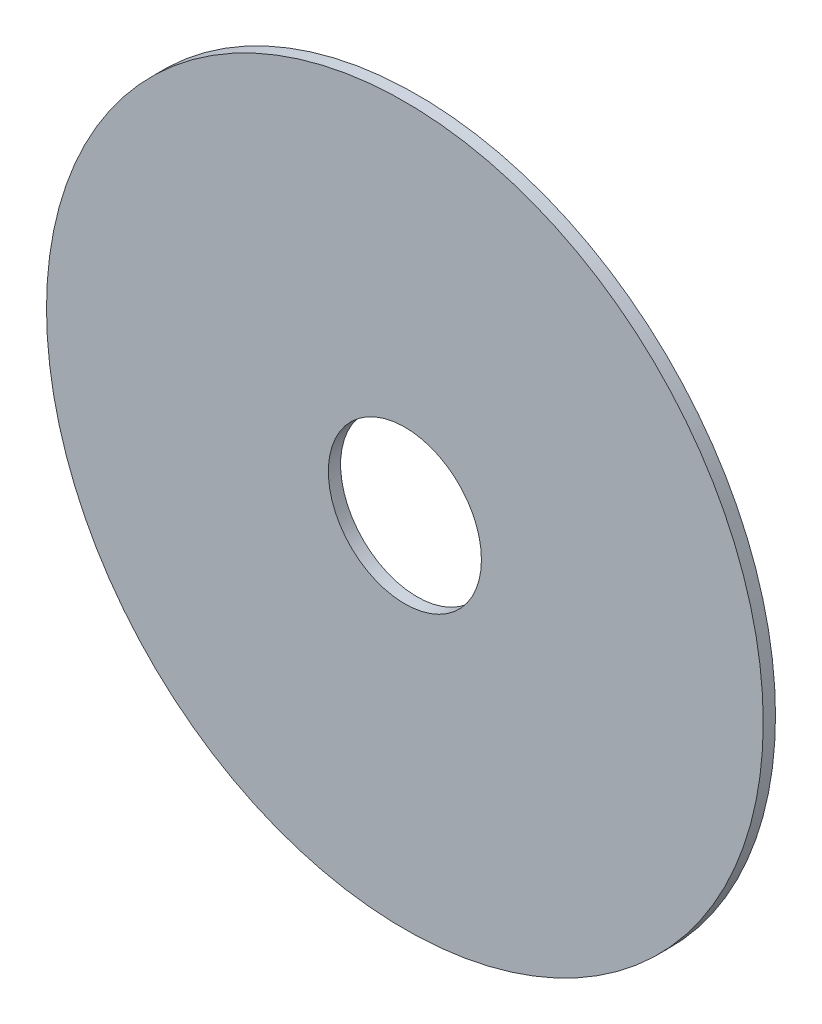
ISO-10303-21;
HEADER;
FILE_DESCRIPTION(('STEP AP214'),'2;1');
FILE_NAME('part.step','',(''),(''),'','','');
FILE_SCHEMA(('AUTOMOTIVE_DESIGN { 1 0 10303 214 1 1 1 1 }'));
ENDSEC;
DATA;
#1=APPLICATION_CONTEXT('core data for automotive mechanical design processes');
#2=APPLICATION_PROTOCOL_DEFINITION('international standard','automotive_design',2000,#1);
#3=PRODUCT_CONTEXT('',#1,'mechanical');
#4=PRODUCT('Part','Part','',(#3));
#5=PRODUCT_RELATED_PRODUCT_CATEGORY('part','',(#4));
#6=PRODUCT_DEFINITION_FORMATION('','',#4);
#7=PRODUCT_DEFINITION_CONTEXT('part definition',#1,'design');
#8=PRODUCT_DEFINITION('design','',#6,#7);
#9=PRODUCT_DEFINITION_SHAPE('','',#8);
#10=(LENGTH_UNIT() NAMED_UNIT(*) SI_UNIT(.MILLI.,.METRE.));
#11=(NAMED_UNIT(*) PLANE_ANGLE_UNIT() SI_UNIT($,.RADIAN.));
#12=(NAMED_UNIT(*) SI_UNIT($,.STERADIAN.) SOLID_ANGLE_UNIT());
#13=UNCERTAINTY_MEASURE_WITH_UNIT(LENGTH_MEASURE(1.E-05),#10,'distance_accuracy_value','');
#14=(GEOMETRIC_REPRESENTATION_CONTEXT(3) GLOBAL_UNCERTAINTY_ASSIGNED_CONTEXT((#13)) GLOBAL_UNIT_ASSIGNED_CONTEXT((#10,
#11,#12)) REPRESENTATION_CONTEXT('',''));
#15=CARTESIAN_POINT('',(0.,0.,0.));
#16=DIRECTION('',(0.,0.,1.));
#17=DIRECTION('',(1.,0.,0.));
#18=AXIS2_PLACEMENT_3D('',#15,#16,#17);
#19=CARTESIAN_POINT('',(0.,0.,2.286));
#20=DIRECTION('',(0.,0.,1.));
#21=DIRECTION('',(1.,0.,0.));
#22=AXIS2_PLACEMENT_3D('',#19,#20,#21);
#23=PLANE('',#22);
#24=CARTESIAN_POINT('',(0.,0.,2.286));
#25=DIRECTION('',(0.,0.,1.));
#26=DIRECTION('',(1.,0.,0.));
#27=AXIS2_PLACEMENT_3D('',#24,#25,#26);
#28=CIRCLE('',#27,66.8909);
#29=CARTESIAN_POINT('',(66.8909,0.,2.286));
#30=VERTEX_POINT('',#29);
#31=EDGE_CURVE('E10',#30,#30,#28,.T.);
#32=ORIENTED_EDGE('',*,*,#31,.T.);
#33=EDGE_LOOP('',(#32));
#34=FACE_BOUND('',#33,.T.);
#35=CARTESIAN_POINT('',(0.,0.,2.286));
#36=DIRECTION('',(0.,0.,1.));
#37=DIRECTION('',(1.,0.,0.));
#38=AXIS2_PLACEMENT_3D('',#35,#36,#37);
#39=CIRCLE('',#38,14.2875);
#40=CARTESIAN_POINT('',(14.2875,0.,2.286));
#41=VERTEX_POINT('',#40);
#42=EDGE_CURVE('E42',#41,#41,#39,.T.);
#43=ORIENTED_EDGE('',*,*,#42,.F.);
#44=EDGE_LOOP('',(#43));
#45=FACE_BOUND('',#44,.T.);
#46=ADVANCED_FACE('F31',(#34,#45),#23,.T.);
#47=CARTESIAN_POINT('',(0.,0.,0.));
#48=DIRECTION('',(0.,0.,1.));
#49=DIRECTION('',(1.,0.,0.));
#50=AXIS2_PLACEMENT_3D('',#47,#48,#49);
#51=PLANE('',#50);
#52=CARTESIAN_POINT('',(0.,0.,0.));
#53=DIRECTION('',(0.,0.,1.));
#54=DIRECTION('',(1.,0.,0.));
#55=AXIS2_PLACEMENT_3D('',#52,#53,#54);
#56=CIRCLE('',#55,66.8909);
#57=CARTESIAN_POINT('',(66.8909,0.,0.));
#58=VERTEX_POINT('',#57);
#59=EDGE_CURVE('E35',#58,#58,#56,.T.);
#60=ORIENTED_EDGE('',*,*,#59,.F.);
#61=EDGE_LOOP('',(#60));
#62=FACE_BOUND('',#61,.T.);
#63=CARTESIAN_POINT('',(0.,0.,0.));
#64=DIRECTION('',(0.,0.,1.));
#65=DIRECTION('',(1.,0.,0.));
#66=AXIS2_PLACEMENT_3D('',#63,#64,#65);
#67=CIRCLE('',#66,14.2875);
#68=CARTESIAN_POINT('',(14.2875,0.,0.));
#69=VERTEX_POINT('',#68);
#70=EDGE_CURVE('E44',#69,#69,#67,.T.);
#71=ORIENTED_EDGE('',*,*,#70,.T.);
#72=EDGE_LOOP('',(#71));
#73=FACE_BOUND('',#72,.T.);
#74=ADVANCED_FACE('F54',(#62,#73),#51,.F.);
#75=CARTESIAN_POINT('',(0.,0.,2.286));
#76=DIRECTION('',(0.,0.,-1.));
#77=DIRECTION('',(-1.,0.,0.));
#78=AXIS2_PLACEMENT_3D('',#75,#76,#77);
#79=CYLINDRICAL_SURFACE('',#78,66.8909);
#80=ORIENTED_EDGE('',*,*,#31,.F.);
#81=EDGE_LOOP('',(#80));
#82=FACE_BOUND('',#81,.T.);
#83=ORIENTED_EDGE('',*,*,#59,.T.);
#84=EDGE_LOOP('',(#83));
#85=FACE_BOUND('',#84,.T.);
#86=ADVANCED_FACE('F33',(#82,#85),#79,.T.);
#87=CARTESIAN_POINT('',(0.,0.,2.286));
#88=DIRECTION('',(0.,0.,-1.));
#89=DIRECTION('',(-1.,0.,0.));
#90=AXIS2_PLACEMENT_3D('',#87,#88,#89);
#91=CYLINDRICAL_SURFACE('',#90,14.2875);
#92=ORIENTED_EDGE('',*,*,#42,.T.);
#93=EDGE_LOOP('',(#92));
#94=FACE_BOUND('',#93,.T.);
#95=ORIENTED_EDGE('',*,*,#70,.F.);
#96=EDGE_LOOP('',(#95));
#97=FACE_BOUND('',#96,.T.);
#98=ADVANCED_FACE('F50',(#94,#97),#91,.F.);
#99=CLOSED_SHELL('',(#46,#74,#86,#98));
#100=MANIFOLD_SOLID_BREP('B2',#99);
#101=ADVANCED_BREP_SHAPE_REPRESENTATION('',(#18,#100),#14);
#102=SHAPE_DEFINITION_REPRESENTATION(#9,#101);
ENDSEC;
END-ISO-10303-21;
